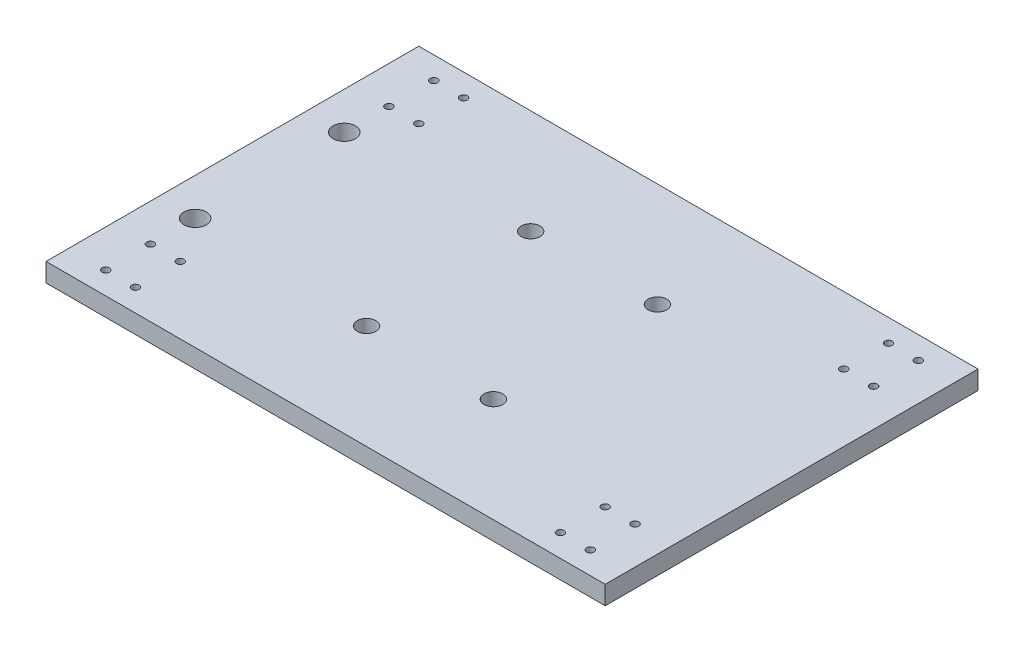
ISO-10303-21;
HEADER;
FILE_DESCRIPTION(('STEP AP214'),'2;1');
FILE_NAME('part.step','',(''),(''),'','','');
FILE_SCHEMA(('AUTOMOTIVE_DESIGN { 1 0 10303 214 1 1 1 1 }'));
ENDSEC;
DATA;
#1=APPLICATION_CONTEXT('core data for automotive mechanical design processes');
#2=APPLICATION_PROTOCOL_DEFINITION('international standard','automotive_design',2000,#1);
#3=PRODUCT_CONTEXT('',#1,'mechanical');
#4=PRODUCT('Part','Part','',(#3));
#5=PRODUCT_RELATED_PRODUCT_CATEGORY('part','',(#4));
#6=PRODUCT_DEFINITION_FORMATION('','',#4);
#7=PRODUCT_DEFINITION_CONTEXT('part definition',#1,'design');
#8=PRODUCT_DEFINITION('design','',#6,#7);
#9=PRODUCT_DEFINITION_SHAPE('','',#8);
#10=(LENGTH_UNIT() NAMED_UNIT(*) SI_UNIT(.MILLI.,.METRE.));
#11=(NAMED_UNIT(*) PLANE_ANGLE_UNIT() SI_UNIT($,.RADIAN.));
#12=(NAMED_UNIT(*) SI_UNIT($,.STERADIAN.) SOLID_ANGLE_UNIT());
#13=UNCERTAINTY_MEASURE_WITH_UNIT(LENGTH_MEASURE(1.E-05),#10,'distance_accuracy_value','');
#14=(GEOMETRIC_REPRESENTATION_CONTEXT(3) GLOBAL_UNCERTAINTY_ASSIGNED_CONTEXT((#13)) GLOBAL_UNIT_ASSIGNED_CONTEXT((#10,
#11,#12)) REPRESENTATION_CONTEXT('',''));
#15=CARTESIAN_POINT('',(0.,0.,0.));
#16=DIRECTION('',(0.,0.,1.));
#17=DIRECTION('',(1.,0.,0.));
#18=AXIS2_PLACEMENT_3D('',#15,#16,#17);
#19=CARTESIAN_POINT('',(75.,5.,-50.));
#20=DIRECTION('',(-1.,0.,0.));
#21=DIRECTION('',(0.,0.,1.));
#22=AXIS2_PLACEMENT_3D('',#19,#20,#21);
#23=PLANE('',#22);
#24=DIRECTION('',(0.,0.,-1.));
#25=VECTOR('',#24,1.);
#26=CARTESIAN_POINT('',(75.,0.,-50.));
#27=LINE('',#26,#25);
#28=CARTESIAN_POINT('',(75.,0.,50.));
#29=VERTEX_POINT('',#28);
#30=CARTESIAN_POINT('',(75.,0.,-50.));
#31=VERTEX_POINT('',#30);
#32=EDGE_CURVE('E100',#29,#31,#27,.T.);
#33=ORIENTED_EDGE('',*,*,#32,.T.);
#34=DIRECTION('',(0.,-1.,0.));
#35=VECTOR('',#34,1.);
#36=CARTESIAN_POINT('',(75.,5.,-50.));
#37=LINE('',#36,#35);
#38=CARTESIAN_POINT('',(75.,5.,-50.));
#39=VERTEX_POINT('',#38);
#40=EDGE_CURVE('E11',#39,#31,#37,.T.);
#41=ORIENTED_EDGE('',*,*,#40,.F.);
#42=DIRECTION('',(0.,0.,-1.));
#43=VECTOR('',#42,1.);
#44=CARTESIAN_POINT('',(75.,5.,-50.));
#45=LINE('',#44,#43);
#46=CARTESIAN_POINT('',(75.,5.,50.));
#47=VERTEX_POINT('',#46);
#48=EDGE_CURVE('E88',#47,#39,#45,.T.);
#49=ORIENTED_EDGE('',*,*,#48,.F.);
#50=DIRECTION('',(0.,-1.,0.));
#51=VECTOR('',#50,1.);
#52=CARTESIAN_POINT('',(75.,5.,50.));
#53=LINE('',#52,#51);
#54=EDGE_CURVE('E96',#47,#29,#53,.T.);
#55=ORIENTED_EDGE('',*,*,#54,.T.);
#56=EDGE_LOOP('',(#33,#41,#49,#55));
#57=FACE_BOUND('',#56,.T.);
#58=ADVANCED_FACE('F37',(#57),#23,.F.);
#59=CARTESIAN_POINT('',(-75.,5.,-50.));
#60=DIRECTION('',(0.,0.,1.));
#61=DIRECTION('',(1.,0.,0.));
#62=AXIS2_PLACEMENT_3D('',#59,#60,#61);
#63=PLANE('',#62);
#64=DIRECTION('',(-1.,0.,0.));
#65=VECTOR('',#64,1.);
#66=CARTESIAN_POINT('',(-75.,0.,-50.));
#67=LINE('',#66,#65);
#68=CARTESIAN_POINT('',(-75.,0.,-50.));
#69=VERTEX_POINT('',#68);
#70=EDGE_CURVE('E92',#31,#69,#67,.T.);
#71=ORIENTED_EDGE('',*,*,#70,.T.);
#72=DIRECTION('',(0.,-1.,0.));
#73=VECTOR('',#72,1.);
#74=CARTESIAN_POINT('',(-75.,5.,-50.));
#75=LINE('',#74,#73);
#76=CARTESIAN_POINT('',(-75.,5.,-50.));
#77=VERTEX_POINT('',#76);
#78=EDGE_CURVE('E45',#77,#69,#75,.T.);
#79=ORIENTED_EDGE('',*,*,#78,.F.);
#80=DIRECTION('',(-1.,0.,0.));
#81=VECTOR('',#80,1.);
#82=CARTESIAN_POINT('',(-75.,5.,-50.));
#83=LINE('',#82,#81);
#84=EDGE_CURVE('E83',#39,#77,#83,.T.);
#85=ORIENTED_EDGE('',*,*,#84,.F.);
#86=ORIENTED_EDGE('',*,*,#40,.T.);
#87=EDGE_LOOP('',(#71,#79,#85,#86));
#88=FACE_BOUND('',#87,.T.);
#89=ADVANCED_FACE('F91',(#88),#63,.F.);
#90=CARTESIAN_POINT('',(-75.,5.,-50.));
#91=DIRECTION('',(1.,0.,0.));
#92=DIRECTION('',(0.,0.,-1.));
#93=AXIS2_PLACEMENT_3D('',#90,#91,#92);
#94=PLANE('',#93);
#95=DIRECTION('',(0.,0.,1.));
#96=VECTOR('',#95,1.);
#97=CARTESIAN_POINT('',(-75.,0.,-50.));
#98=LINE('',#97,#96);
#99=CARTESIAN_POINT('',(-75.,0.,50.));
#100=VERTEX_POINT('',#99);
#101=EDGE_CURVE('E70',#69,#100,#98,.T.);
#102=ORIENTED_EDGE('',*,*,#101,.T.);
#103=DIRECTION('',(0.,-1.,0.));
#104=VECTOR('',#103,1.);
#105=CARTESIAN_POINT('',(-75.,5.,50.));
#106=LINE('',#105,#104);
#107=CARTESIAN_POINT('',(-75.,5.,50.));
#108=VERTEX_POINT('',#107);
#109=EDGE_CURVE('E93',#108,#100,#106,.T.);
#110=ORIENTED_EDGE('',*,*,#109,.F.);
#111=DIRECTION('',(0.,0.,1.));
#112=VECTOR('',#111,1.);
#113=CARTESIAN_POINT('',(-75.,5.,-50.));
#114=LINE('',#113,#112);
#115=EDGE_CURVE('E86',#77,#108,#114,.T.);
#116=ORIENTED_EDGE('',*,*,#115,.F.);
#117=ORIENTED_EDGE('',*,*,#78,.T.);
#118=EDGE_LOOP('',(#102,#110,#116,#117));
#119=FACE_BOUND('',#118,.T.);
#120=ADVANCED_FACE('F94',(#119),#94,.F.);
#121=CARTESIAN_POINT('',(-75.,5.,50.));
#122=DIRECTION('',(0.,0.,-1.));
#123=DIRECTION('',(-1.,0.,0.));
#124=AXIS2_PLACEMENT_3D('',#121,#122,#123);
#125=PLANE('',#124);
#126=DIRECTION('',(1.,0.,0.));
#127=VECTOR('',#126,1.);
#128=CARTESIAN_POINT('',(-75.,0.,50.));
#129=LINE('',#128,#127);
#130=EDGE_CURVE('E76',#100,#29,#129,.T.);
#131=ORIENTED_EDGE('',*,*,#130,.T.);
#132=ORIENTED_EDGE('',*,*,#54,.F.);
#133=DIRECTION('',(1.,0.,0.));
#134=VECTOR('',#133,1.);
#135=CARTESIAN_POINT('',(-75.,5.,50.));
#136=LINE('',#135,#134);
#137=EDGE_CURVE('E53',#108,#47,#136,.T.);
#138=ORIENTED_EDGE('',*,*,#137,.F.);
#139=ORIENTED_EDGE('',*,*,#109,.T.);
#140=EDGE_LOOP('',(#131,#132,#138,#139));
#141=FACE_BOUND('',#140,.T.);
#142=ADVANCED_FACE('F108',(#141),#125,.F.);
#143=CARTESIAN_POINT('',(0.,5.,0.));
#144=DIRECTION('',(0.,1.,0.));
#145=DIRECTION('',(0.,0.,1.));
#146=AXIS2_PLACEMENT_3D('',#143,#144,#145);
#147=PLANE('',#146);
#148=CARTESIAN_POINT('',(-65.,5.,-20.));
#149=DIRECTION('',(0.,1.,0.));
#150=DIRECTION('',(0.,0.,1.));
#151=AXIS2_PLACEMENT_3D('',#148,#149,#150);
#152=CIRCLE('',#151,3.);
#153=CARTESIAN_POINT('',(-65.,5.,-17.));
#154=VERTEX_POINT('',#153);
#155=EDGE_CURVE('E240',#154,#154,#152,.T.);
#156=ORIENTED_EDGE('',*,*,#155,.F.);
#157=EDGE_LOOP('',(#156));
#158=FACE_BOUND('',#157,.T.);
#159=CARTESIAN_POINT('',(-65.,5.,20.));
#160=DIRECTION('',(0.,1.,0.));
#161=DIRECTION('',(0.,0.,-1.));
#162=AXIS2_PLACEMENT_3D('',#159,#160,#161);
#163=CIRCLE('',#162,2.99999999999999);
#164=CARTESIAN_POINT('',(-65.,5.,17.));
#165=VERTEX_POINT('',#164);
#166=EDGE_CURVE('E234',#165,#165,#163,.T.);
#167=ORIENTED_EDGE('',*,*,#166,.F.);
#168=EDGE_LOOP('',(#167));
#169=FACE_BOUND('',#168,.T.);
#170=CARTESIAN_POINT('',(57.,5.,-44.));
#171=DIRECTION('',(0.,1.,0.));
#172=DIRECTION('',(0.,0.,1.));
#173=AXIS2_PLACEMENT_3D('',#170,#171,#172);
#174=CIRCLE('',#173,0.999999999999992);
#175=CARTESIAN_POINT('',(57.,5.,-43.));
#176=VERTEX_POINT('',#175);
#177=EDGE_CURVE('E180',#176,#176,#174,.T.);
#178=ORIENTED_EDGE('',*,*,#177,.F.);
#179=EDGE_LOOP('',(#178));
#180=FACE_BOUND('',#179,.T.);
#181=CARTESIAN_POINT('',(-57.,5.,-32.));
#182=DIRECTION('',(0.,1.,0.));
#183=DIRECTION('',(0.,0.,-1.));
#184=AXIS2_PLACEMENT_3D('',#181,#182,#183);
#185=CIRCLE('',#184,0.999999999999998);
#186=CARTESIAN_POINT('',(-57.,5.,-33.));
#187=VERTEX_POINT('',#186);
#188=EDGE_CURVE('E187',#187,#187,#185,.T.);
#189=ORIENTED_EDGE('',*,*,#188,.F.);
#190=EDGE_LOOP('',(#189));
#191=FACE_BOUND('',#190,.T.);
#192=CARTESIAN_POINT('',(-65.,5.,-32.));
#193=DIRECTION('',(0.,1.,0.));
#194=DIRECTION('',(0.,0.,-1.));
#195=AXIS2_PLACEMENT_3D('',#192,#193,#194);
#196=CIRCLE('',#195,0.999999999999998);
#197=CARTESIAN_POINT('',(-65.,5.,-33.));
#198=VERTEX_POINT('',#197);
#199=EDGE_CURVE('E168',#198,#198,#196,.T.);
#200=ORIENTED_EDGE('',*,*,#199,.F.);
#201=EDGE_LOOP('',(#200));
#202=FACE_BOUND('',#201,.T.);
#203=CARTESIAN_POINT('',(57.,5.,44.));
#204=DIRECTION('',(0.,1.,0.));
#205=DIRECTION('',(0.,0.,-1.));
#206=AXIS2_PLACEMENT_3D('',#203,#204,#205);
#207=CIRCLE('',#206,0.999999999999992);
#208=CARTESIAN_POINT('',(57.,5.,43.));
#209=VERTEX_POINT('',#208);
#210=EDGE_CURVE('E175',#209,#209,#207,.T.);
#211=ORIENTED_EDGE('',*,*,#210,.F.);
#212=EDGE_LOOP('',(#211));
#213=FACE_BOUND('',#212,.T.);
#214=CARTESIAN_POINT('',(-57.,5.,44.));
#215=DIRECTION('',(0.,1.,0.));
#216=DIRECTION('',(0.,0.,1.));
#217=AXIS2_PLACEMENT_3D('',#214,#215,#216);
#218=CIRCLE('',#217,0.999999999999998);
#219=CARTESIAN_POINT('',(-57.,5.,45.));
#220=VERTEX_POINT('',#219);
#221=EDGE_CURVE('E204',#220,#220,#218,.T.);
#222=ORIENTED_EDGE('',*,*,#221,.F.);
#223=EDGE_LOOP('',(#222));
#224=FACE_BOUND('',#223,.T.);
#225=CARTESIAN_POINT('',(-57.,5.,-44.));
#226=DIRECTION('',(0.,1.,0.));
#227=DIRECTION('',(0.,0.,-1.));
#228=AXIS2_PLACEMENT_3D('',#225,#226,#227);
#229=CIRCLE('',#228,0.999999999999998);
#230=CARTESIAN_POINT('',(-57.,5.,-45.));
#231=VERTEX_POINT('',#230);
#232=EDGE_CURVE('E211',#231,#231,#229,.T.);
#233=ORIENTED_EDGE('',*,*,#232,.F.);
#234=EDGE_LOOP('',(#233));
#235=FACE_BOUND('',#234,.T.);
#236=CARTESIAN_POINT('',(-65.,5.,-44.));
#237=DIRECTION('',(0.,1.,0.));
#238=DIRECTION('',(0.,0.,-1.));
#239=AXIS2_PLACEMENT_3D('',#236,#237,#238);
#240=CIRCLE('',#239,0.999999999999998);
#241=CARTESIAN_POINT('',(-65.,5.,-45.));
#242=VERTEX_POINT('',#241);
#243=EDGE_CURVE('E192',#242,#242,#240,.T.);
#244=ORIENTED_EDGE('',*,*,#243,.F.);
#245=EDGE_LOOP('',(#244));
#246=FACE_BOUND('',#245,.T.);
#247=CARTESIAN_POINT('',(57.,5.,-32.));
#248=DIRECTION('',(0.,1.,0.));
#249=DIRECTION('',(0.,0.,1.));
#250=AXIS2_PLACEMENT_3D('',#247,#248,#249);
#251=CIRCLE('',#250,0.999999999999992);
#252=CARTESIAN_POINT('',(57.,5.,-31.));
#253=VERTEX_POINT('',#252);
#254=EDGE_CURVE('E199',#253,#253,#251,.T.);
#255=ORIENTED_EDGE('',*,*,#254,.F.);
#256=EDGE_LOOP('',(#255));
#257=FACE_BOUND('',#256,.T.);
#258=CARTESIAN_POINT('',(65.,5.,-44.));
#259=DIRECTION('',(0.,1.,0.));
#260=DIRECTION('',(0.,0.,1.));
#261=AXIS2_PLACEMENT_3D('',#258,#259,#260);
#262=CIRCLE('',#261,0.999999999999998);
#263=CARTESIAN_POINT('',(65.,5.,-43.));
#264=VERTEX_POINT('',#263);
#265=EDGE_CURVE('E132',#264,#264,#262,.T.);
#266=ORIENTED_EDGE('',*,*,#265,.F.);
#267=EDGE_LOOP('',(#266));
#268=FACE_BOUND('',#267,.T.);
#269=CARTESIAN_POINT('',(-17.,5.,22.));
#270=DIRECTION('',(0.,1.,0.));
#271=DIRECTION('',(0.,0.,1.));
#272=AXIS2_PLACEMENT_3D('',#269,#270,#271);
#273=CIRCLE('',#272,2.5);
#274=CARTESIAN_POINT('',(-17.,5.,24.5));
#275=VERTEX_POINT('',#274);
#276=EDGE_CURVE('E139',#275,#275,#273,.T.);
#277=ORIENTED_EDGE('',*,*,#276,.F.);
#278=EDGE_LOOP('',(#277));
#279=FACE_BOUND('',#278,.T.);
#280=CARTESIAN_POINT('',(-17.,5.,-22.));
#281=DIRECTION('',(0.,1.,0.));
#282=DIRECTION('',(0.,0.,-1.));
#283=AXIS2_PLACEMENT_3D('',#280,#281,#282);
#284=CIRCLE('',#283,2.5);
#285=CARTESIAN_POINT('',(-17.,5.,-24.5));
#286=VERTEX_POINT('',#285);
#287=EDGE_CURVE('E120',#286,#286,#284,.T.);
#288=ORIENTED_EDGE('',*,*,#287,.F.);
#289=EDGE_LOOP('',(#288));
#290=FACE_BOUND('',#289,.T.);
#291=CARTESIAN_POINT('',(17.,5.,22.));
#292=DIRECTION('',(0.,1.,0.));
#293=DIRECTION('',(0.,0.,-1.));
#294=AXIS2_PLACEMENT_3D('',#291,#292,#293);
#295=CIRCLE('',#294,2.5);
#296=CARTESIAN_POINT('',(17.,5.,19.5));
#297=VERTEX_POINT('',#296);
#298=EDGE_CURVE('E127',#297,#297,#295,.T.);
#299=ORIENTED_EDGE('',*,*,#298,.F.);
#300=EDGE_LOOP('',(#299));
#301=FACE_BOUND('',#300,.T.);
#302=CARTESIAN_POINT('',(65.,5.,44.));
#303=DIRECTION('',(0.,1.,0.));
#304=DIRECTION('',(0.,0.,-1.));
#305=AXIS2_PLACEMENT_3D('',#302,#303,#304);
#306=CIRCLE('',#305,0.999999999999998);
#307=CARTESIAN_POINT('',(65.,5.,43.));
#308=VERTEX_POINT('',#307);
#309=EDGE_CURVE('E156',#308,#308,#306,.T.);
#310=ORIENTED_EDGE('',*,*,#309,.F.);
#311=EDGE_LOOP('',(#310));
#312=FACE_BOUND('',#311,.T.);
#313=CARTESIAN_POINT('',(57.,5.,32.));
#314=DIRECTION('',(0.,1.,0.));
#315=DIRECTION('',(0.,0.,-1.));
#316=AXIS2_PLACEMENT_3D('',#313,#314,#315);
#317=CIRCLE('',#316,0.999999999999992);
#318=CARTESIAN_POINT('',(57.,5.,31.));
#319=VERTEX_POINT('',#318);
#320=EDGE_CURVE('E163',#319,#319,#317,.T.);
#321=ORIENTED_EDGE('',*,*,#320,.F.);
#322=EDGE_LOOP('',(#321));
#323=FACE_BOUND('',#322,.T.);
#324=CARTESIAN_POINT('',(65.,5.,32.));
#325=DIRECTION('',(0.,1.,0.));
#326=DIRECTION('',(0.,0.,-1.));
#327=AXIS2_PLACEMENT_3D('',#324,#325,#326);
#328=CIRCLE('',#327,0.999999999999998);
#329=CARTESIAN_POINT('',(65.,5.,31.));
#330=VERTEX_POINT('',#329);
#331=EDGE_CURVE('E144',#330,#330,#328,.T.);
#332=ORIENTED_EDGE('',*,*,#331,.F.);
#333=EDGE_LOOP('',(#332));
#334=FACE_BOUND('',#333,.T.);
#335=CARTESIAN_POINT('',(65.,5.,-32.));
#336=DIRECTION('',(0.,1.,0.));
#337=DIRECTION('',(0.,0.,1.));
#338=AXIS2_PLACEMENT_3D('',#335,#336,#337);
#339=CIRCLE('',#338,0.999999999999998);
#340=CARTESIAN_POINT('',(65.,5.,-31.));
#341=VERTEX_POINT('',#340);
#342=EDGE_CURVE('E151',#341,#341,#339,.T.);
#343=ORIENTED_EDGE('',*,*,#342,.F.);
#344=EDGE_LOOP('',(#343));
#345=FACE_BOUND('',#344,.T.);
#346=CARTESIAN_POINT('',(-65.,5.,32.));
#347=DIRECTION('',(0.,1.,0.));
#348=DIRECTION('',(0.,0.,1.));
#349=AXIS2_PLACEMENT_3D('',#346,#347,#348);
#350=CIRCLE('',#349,0.999999999999998);
#351=CARTESIAN_POINT('',(-65.,5.,33.));
#352=VERTEX_POINT('',#351);
#353=EDGE_CURVE('E228',#352,#352,#350,.T.);
#354=ORIENTED_EDGE('',*,*,#353,.F.);
#355=EDGE_LOOP('',(#354));
#356=FACE_BOUND('',#355,.T.);
#357=CARTESIAN_POINT('',(-57.,5.,32.));
#358=DIRECTION('',(0.,1.,0.));
#359=DIRECTION('',(0.,0.,1.));
#360=AXIS2_PLACEMENT_3D('',#357,#358,#359);
#361=CIRCLE('',#360,0.999999999999998);
#362=CARTESIAN_POINT('',(-57.,5.,33.));
#363=VERTEX_POINT('',#362);
#364=EDGE_CURVE('E216',#363,#363,#361,.T.);
#365=ORIENTED_EDGE('',*,*,#364,.F.);
#366=EDGE_LOOP('',(#365));
#367=FACE_BOUND('',#366,.T.);
#368=CARTESIAN_POINT('',(-65.,5.,44.));
#369=DIRECTION('',(0.,1.,0.));
#370=DIRECTION('',(0.,0.,1.));
#371=AXIS2_PLACEMENT_3D('',#368,#369,#370);
#372=CIRCLE('',#371,0.999999999999998);
#373=CARTESIAN_POINT('',(-65.,5.,45.));
#374=VERTEX_POINT('',#373);
#375=EDGE_CURVE('E223',#374,#374,#372,.T.);
#376=ORIENTED_EDGE('',*,*,#375,.F.);
#377=EDGE_LOOP('',(#376));
#378=FACE_BOUND('',#377,.T.);
#379=CARTESIAN_POINT('',(17.,5.,-22.));
#380=DIRECTION('',(0.,1.,0.));
#381=DIRECTION('',(0.,0.,1.));
#382=AXIS2_PLACEMENT_3D('',#379,#380,#381);
#383=CIRCLE('',#382,2.5);
#384=CARTESIAN_POINT('',(17.,5.,-19.5));
#385=VERTEX_POINT('',#384);
#386=EDGE_CURVE('E114',#385,#385,#383,.T.);
#387=ORIENTED_EDGE('',*,*,#386,.F.);
#388=EDGE_LOOP('',(#387));
#389=FACE_BOUND('',#388,.T.);
#390=ORIENTED_EDGE('',*,*,#48,.T.);
#391=ORIENTED_EDGE('',*,*,#84,.T.);
#392=ORIENTED_EDGE('',*,*,#115,.T.);
#393=ORIENTED_EDGE('',*,*,#137,.T.);
#394=EDGE_LOOP('',(#390,#391,#392,#393));
#395=FACE_BOUND('',#394,.T.);
#396=ADVANCED_FACE('F84',(#158,#169,#180,#191,#202,#213,#224,#235,#246,#257,#268,#279,#290,#301,
#312,#323,#334,#345,#356,#367,#378,#389,#395),#147,.T.);
#397=CARTESIAN_POINT('',(0.,0.,0.));
#398=DIRECTION('',(0.,1.,0.));
#399=DIRECTION('',(0.,0.,1.));
#400=AXIS2_PLACEMENT_3D('',#397,#398,#399);
#401=PLANE('',#400);
#402=CARTESIAN_POINT('',(-65.,0.,-20.));
#403=DIRECTION('',(0.,1.,0.));
#404=DIRECTION('',(0.,0.,1.));
#405=AXIS2_PLACEMENT_3D('',#402,#403,#404);
#406=CIRCLE('',#405,3.);
#407=CARTESIAN_POINT('',(-65.,0.,-17.));
#408=VERTEX_POINT('',#407);
#409=EDGE_CURVE('E231',#408,#408,#406,.T.);
#410=ORIENTED_EDGE('',*,*,#409,.T.);
#411=EDGE_LOOP('',(#410));
#412=FACE_BOUND('',#411,.T.);
#413=CARTESIAN_POINT('',(-65.,0.,20.));
#414=DIRECTION('',(0.,1.,0.));
#415=DIRECTION('',(0.,0.,-1.));
#416=AXIS2_PLACEMENT_3D('',#413,#414,#415);
#417=CIRCLE('',#416,2.99999999999999);
#418=CARTESIAN_POINT('',(-65.,0.,17.));
#419=VERTEX_POINT('',#418);
#420=EDGE_CURVE('E237',#419,#419,#417,.T.);
#421=ORIENTED_EDGE('',*,*,#420,.T.);
#422=EDGE_LOOP('',(#421));
#423=FACE_BOUND('',#422,.T.);
#424=CARTESIAN_POINT('',(57.,0.,-44.));
#425=DIRECTION('',(0.,1.,0.));
#426=DIRECTION('',(0.,0.,1.));
#427=AXIS2_PLACEMENT_3D('',#424,#425,#426);
#428=CIRCLE('',#427,0.999999999999992);
#429=CARTESIAN_POINT('',(57.,0.,-43.));
#430=VERTEX_POINT('',#429);
#431=EDGE_CURVE('E183',#430,#430,#428,.T.);
#432=ORIENTED_EDGE('',*,*,#431,.T.);
#433=EDGE_LOOP('',(#432));
#434=FACE_BOUND('',#433,.T.);
#435=CARTESIAN_POINT('',(-57.,0.,-32.));
#436=DIRECTION('',(0.,1.,0.));
#437=DIRECTION('',(0.,0.,-1.));
#438=AXIS2_PLACEMENT_3D('',#435,#436,#437);
#439=CIRCLE('',#438,0.999999999999998);
#440=CARTESIAN_POINT('',(-57.,0.,-33.));
#441=VERTEX_POINT('',#440);
#442=EDGE_CURVE('E172',#441,#441,#439,.T.);
#443=ORIENTED_EDGE('',*,*,#442,.T.);
#444=EDGE_LOOP('',(#443));
#445=FACE_BOUND('',#444,.T.);
#446=CARTESIAN_POINT('',(-65.,0.,-32.));
#447=DIRECTION('',(0.,1.,0.));
#448=DIRECTION('',(0.,0.,-1.));
#449=AXIS2_PLACEMENT_3D('',#446,#447,#448);
#450=CIRCLE('',#449,0.999999999999998);
#451=CARTESIAN_POINT('',(-65.,0.,-33.));
#452=VERTEX_POINT('',#451);
#453=EDGE_CURVE('E171',#452,#452,#450,.T.);
#454=ORIENTED_EDGE('',*,*,#453,.T.);
#455=EDGE_LOOP('',(#454));
#456=FACE_BOUND('',#455,.T.);
#457=CARTESIAN_POINT('',(57.,0.,44.));
#458=DIRECTION('',(0.,1.,0.));
#459=DIRECTION('',(0.,0.,-1.));
#460=AXIS2_PLACEMENT_3D('',#457,#458,#459);
#461=CIRCLE('',#460,0.999999999999992);
#462=CARTESIAN_POINT('',(57.,0.,43.));
#463=VERTEX_POINT('',#462);
#464=EDGE_CURVE('E160',#463,#463,#461,.T.);
#465=ORIENTED_EDGE('',*,*,#464,.T.);
#466=EDGE_LOOP('',(#465));
#467=FACE_BOUND('',#466,.T.);
#468=CARTESIAN_POINT('',(-57.,0.,44.));
#469=DIRECTION('',(0.,1.,0.));
#470=DIRECTION('',(0.,0.,1.));
#471=AXIS2_PLACEMENT_3D('',#468,#469,#470);
#472=CIRCLE('',#471,0.999999999999998);
#473=CARTESIAN_POINT('',(-57.,0.,45.));
#474=VERTEX_POINT('',#473);
#475=EDGE_CURVE('E207',#474,#474,#472,.T.);
#476=ORIENTED_EDGE('',*,*,#475,.T.);
#477=EDGE_LOOP('',(#476));
#478=FACE_BOUND('',#477,.T.);
#479=CARTESIAN_POINT('',(-57.,0.,-44.));
#480=DIRECTION('',(0.,1.,0.));
#481=DIRECTION('',(0.,0.,-1.));
#482=AXIS2_PLACEMENT_3D('',#479,#480,#481);
#483=CIRCLE('',#482,0.999999999999998);
#484=CARTESIAN_POINT('',(-57.,0.,-45.));
#485=VERTEX_POINT('',#484);
#486=EDGE_CURVE('E196',#485,#485,#483,.T.);
#487=ORIENTED_EDGE('',*,*,#486,.T.);
#488=EDGE_LOOP('',(#487));
#489=FACE_BOUND('',#488,.T.);
#490=CARTESIAN_POINT('',(-65.,0.,-44.));
#491=DIRECTION('',(0.,1.,0.));
#492=DIRECTION('',(0.,0.,-1.));
#493=AXIS2_PLACEMENT_3D('',#490,#491,#492);
#494=CIRCLE('',#493,0.999999999999998);
#495=CARTESIAN_POINT('',(-65.,0.,-45.));
#496=VERTEX_POINT('',#495);
#497=EDGE_CURVE('E195',#496,#496,#494,.T.);
#498=ORIENTED_EDGE('',*,*,#497,.T.);
#499=EDGE_LOOP('',(#498));
#500=FACE_BOUND('',#499,.T.);
#501=CARTESIAN_POINT('',(57.,0.,-32.));
#502=DIRECTION('',(0.,1.,0.));
#503=DIRECTION('',(0.,0.,1.));
#504=AXIS2_PLACEMENT_3D('',#501,#502,#503);
#505=CIRCLE('',#504,0.999999999999992);
#506=CARTESIAN_POINT('',(57.,0.,-31.));
#507=VERTEX_POINT('',#506);
#508=EDGE_CURVE('E184',#507,#507,#505,.T.);
#509=ORIENTED_EDGE('',*,*,#508,.T.);
#510=EDGE_LOOP('',(#509));
#511=FACE_BOUND('',#510,.T.);
#512=CARTESIAN_POINT('',(65.,0.,-44.));
#513=DIRECTION('',(0.,1.,0.));
#514=DIRECTION('',(0.,0.,1.));
#515=AXIS2_PLACEMENT_3D('',#512,#513,#514);
#516=CIRCLE('',#515,0.999999999999998);
#517=CARTESIAN_POINT('',(65.,0.,-43.));
#518=VERTEX_POINT('',#517);
#519=EDGE_CURVE('E135',#518,#518,#516,.T.);
#520=ORIENTED_EDGE('',*,*,#519,.T.);
#521=EDGE_LOOP('',(#520));
#522=FACE_BOUND('',#521,.T.);
#523=CARTESIAN_POINT('',(-17.,0.,22.));
#524=DIRECTION('',(0.,1.,0.));
#525=DIRECTION('',(0.,0.,1.));
#526=AXIS2_PLACEMENT_3D('',#523,#524,#525);
#527=CIRCLE('',#526,2.5);
#528=CARTESIAN_POINT('',(-17.,0.,24.5));
#529=VERTEX_POINT('',#528);
#530=EDGE_CURVE('E124',#529,#529,#527,.T.);
#531=ORIENTED_EDGE('',*,*,#530,.T.);
#532=EDGE_LOOP('',(#531));
#533=FACE_BOUND('',#532,.T.);
#534=CARTESIAN_POINT('',(-17.,0.,-22.));
#535=DIRECTION('',(0.,1.,0.));
#536=DIRECTION('',(0.,0.,-1.));
#537=AXIS2_PLACEMENT_3D('',#534,#535,#536);
#538=CIRCLE('',#537,2.5);
#539=CARTESIAN_POINT('',(-17.,0.,-24.5));
#540=VERTEX_POINT('',#539);
#541=EDGE_CURVE('E123',#540,#540,#538,.T.);
#542=ORIENTED_EDGE('',*,*,#541,.T.);
#543=EDGE_LOOP('',(#542));
#544=FACE_BOUND('',#543,.T.);
#545=CARTESIAN_POINT('',(17.,0.,22.));
#546=DIRECTION('',(0.,1.,0.));
#547=DIRECTION('',(0.,0.,-1.));
#548=AXIS2_PLACEMENT_3D('',#545,#546,#547);
#549=CIRCLE('',#548,2.5);
#550=CARTESIAN_POINT('',(17.,0.,19.5));
#551=VERTEX_POINT('',#550);
#552=EDGE_CURVE('E117',#551,#551,#549,.T.);
#553=ORIENTED_EDGE('',*,*,#552,.T.);
#554=EDGE_LOOP('',(#553));
#555=FACE_BOUND('',#554,.T.);
#556=CARTESIAN_POINT('',(65.,0.,44.));
#557=DIRECTION('',(0.,1.,0.));
#558=DIRECTION('',(0.,0.,-1.));
#559=AXIS2_PLACEMENT_3D('',#556,#557,#558);
#560=CIRCLE('',#559,0.999999999999998);
#561=CARTESIAN_POINT('',(65.,0.,43.));
#562=VERTEX_POINT('',#561);
#563=EDGE_CURVE('E159',#562,#562,#560,.T.);
#564=ORIENTED_EDGE('',*,*,#563,.T.);
#565=EDGE_LOOP('',(#564));
#566=FACE_BOUND('',#565,.T.);
#567=CARTESIAN_POINT('',(57.,0.,32.));
#568=DIRECTION('',(0.,1.,0.));
#569=DIRECTION('',(0.,0.,-1.));
#570=AXIS2_PLACEMENT_3D('',#567,#568,#569);
#571=CIRCLE('',#570,0.999999999999992);
#572=CARTESIAN_POINT('',(57.,0.,31.));
#573=VERTEX_POINT('',#572);
#574=EDGE_CURVE('E148',#573,#573,#571,.T.);
#575=ORIENTED_EDGE('',*,*,#574,.T.);
#576=EDGE_LOOP('',(#575));
#577=FACE_BOUND('',#576,.T.);
#578=CARTESIAN_POINT('',(65.,0.,32.));
#579=DIRECTION('',(0.,1.,0.));
#580=DIRECTION('',(0.,0.,-1.));
#581=AXIS2_PLACEMENT_3D('',#578,#579,#580);
#582=CIRCLE('',#581,0.999999999999998);
#583=CARTESIAN_POINT('',(65.,0.,31.));
#584=VERTEX_POINT('',#583);
#585=EDGE_CURVE('E147',#584,#584,#582,.T.);
#586=ORIENTED_EDGE('',*,*,#585,.T.);
#587=EDGE_LOOP('',(#586));
#588=FACE_BOUND('',#587,.T.);
#589=CARTESIAN_POINT('',(65.,0.,-32.));
#590=DIRECTION('',(0.,1.,0.));
#591=DIRECTION('',(0.,0.,1.));
#592=AXIS2_PLACEMENT_3D('',#589,#590,#591);
#593=CIRCLE('',#592,0.999999999999998);
#594=CARTESIAN_POINT('',(65.,0.,-31.));
#595=VERTEX_POINT('',#594);
#596=EDGE_CURVE('E136',#595,#595,#593,.T.);
#597=ORIENTED_EDGE('',*,*,#596,.T.);
#598=EDGE_LOOP('',(#597));
#599=FACE_BOUND('',#598,.T.);
#600=CARTESIAN_POINT('',(-65.,0.,32.));
#601=DIRECTION('',(0.,1.,0.));
#602=DIRECTION('',(0.,0.,1.));
#603=AXIS2_PLACEMENT_3D('',#600,#601,#602);
#604=CIRCLE('',#603,0.999999999999998);
#605=CARTESIAN_POINT('',(-65.,0.,33.));
#606=VERTEX_POINT('',#605);
#607=EDGE_CURVE('E220',#606,#606,#604,.T.);
#608=ORIENTED_EDGE('',*,*,#607,.T.);
#609=EDGE_LOOP('',(#608));
#610=FACE_BOUND('',#609,.T.);
#611=CARTESIAN_POINT('',(-57.,0.,32.));
#612=DIRECTION('',(0.,1.,0.));
#613=DIRECTION('',(0.,0.,1.));
#614=AXIS2_PLACEMENT_3D('',#611,#612,#613);
#615=CIRCLE('',#614,0.999999999999998);
#616=CARTESIAN_POINT('',(-57.,0.,33.));
#617=VERTEX_POINT('',#616);
#618=EDGE_CURVE('E219',#617,#617,#615,.T.);
#619=ORIENTED_EDGE('',*,*,#618,.T.);
#620=EDGE_LOOP('',(#619));
#621=FACE_BOUND('',#620,.T.);
#622=CARTESIAN_POINT('',(-65.,0.,44.));
#623=DIRECTION('',(0.,1.,0.));
#624=DIRECTION('',(0.,0.,1.));
#625=AXIS2_PLACEMENT_3D('',#622,#623,#624);
#626=CIRCLE('',#625,0.999999999999998);
#627=CARTESIAN_POINT('',(-65.,0.,45.));
#628=VERTEX_POINT('',#627);
#629=EDGE_CURVE('E208',#628,#628,#626,.T.);
#630=ORIENTED_EDGE('',*,*,#629,.T.);
#631=EDGE_LOOP('',(#630));
#632=FACE_BOUND('',#631,.T.);
#633=CARTESIAN_POINT('',(17.,0.,-22.));
#634=DIRECTION('',(0.,1.,0.));
#635=DIRECTION('',(0.,0.,1.));
#636=AXIS2_PLACEMENT_3D('',#633,#634,#635);
#637=CIRCLE('',#636,2.5);
#638=CARTESIAN_POINT('',(17.,0.,-19.5));
#639=VERTEX_POINT('',#638);
#640=EDGE_CURVE('E103',#639,#639,#637,.T.);
#641=ORIENTED_EDGE('',*,*,#640,.T.);
#642=EDGE_LOOP('',(#641));
#643=FACE_BOUND('',#642,.T.);
#644=ORIENTED_EDGE('',*,*,#32,.F.);
#645=ORIENTED_EDGE('',*,*,#130,.F.);
#646=ORIENTED_EDGE('',*,*,#101,.F.);
#647=ORIENTED_EDGE('',*,*,#70,.F.);
#648=EDGE_LOOP('',(#644,#645,#646,#647));
#649=FACE_BOUND('',#648,.T.);
#650=ADVANCED_FACE('F111',(#412,#423,#434,#445,#456,#467,#478,#489,#500,#511,#522,#533,#544,
#555,#566,#577,#588,#599,#610,#621,#632,#643,#649),#401,.F.);
#651=CARTESIAN_POINT('',(17.,0.,-22.));
#652=DIRECTION('',(0.,1.,0.));
#653=DIRECTION('',(0.,0.,1.));
#654=AXIS2_PLACEMENT_3D('',#651,#652,#653);
#655=CYLINDRICAL_SURFACE('',#654,2.5);
#656=ORIENTED_EDGE('',*,*,#640,.F.);
#657=EDGE_LOOP('',(#656));
#658=FACE_BOUND('',#657,.T.);
#659=ORIENTED_EDGE('',*,*,#386,.T.);
#660=EDGE_LOOP('',(#659));
#661=FACE_BOUND('',#660,.T.);
#662=ADVANCED_FACE('F300',(#658,#661),#655,.F.);
#663=CARTESIAN_POINT('',(-65.,0.,44.));
#664=DIRECTION('',(0.,1.,0.));
#665=DIRECTION('',(0.,0.,1.));
#666=AXIS2_PLACEMENT_3D('',#663,#664,#665);
#667=CYLINDRICAL_SURFACE('',#666,0.999999999999998);
#668=ORIENTED_EDGE('',*,*,#629,.F.);
#669=EDGE_LOOP('',(#668));
#670=FACE_BOUND('',#669,.T.);
#671=ORIENTED_EDGE('',*,*,#375,.T.);
#672=EDGE_LOOP('',(#671));
#673=FACE_BOUND('',#672,.T.);
#674=ADVANCED_FACE('F302',(#670,#673),#667,.F.);
#675=CARTESIAN_POINT('',(-57.,0.,32.));
#676=DIRECTION('',(0.,1.,0.));
#677=DIRECTION('',(0.,0.,1.));
#678=AXIS2_PLACEMENT_3D('',#675,#676,#677);
#679=CYLINDRICAL_SURFACE('',#678,0.999999999999998);
#680=ORIENTED_EDGE('',*,*,#618,.F.);
#681=EDGE_LOOP('',(#680));
#682=FACE_BOUND('',#681,.T.);
#683=ORIENTED_EDGE('',*,*,#364,.T.);
#684=EDGE_LOOP('',(#683));
#685=FACE_BOUND('',#684,.T.);
#686=ADVANCED_FACE('F309',(#682,#685),#679,.F.);
#687=CARTESIAN_POINT('',(-65.,0.,32.));
#688=DIRECTION('',(0.,1.,0.));
#689=DIRECTION('',(0.,0.,1.));
#690=AXIS2_PLACEMENT_3D('',#687,#688,#689);
#691=CYLINDRICAL_SURFACE('',#690,0.999999999999998);
#692=ORIENTED_EDGE('',*,*,#607,.F.);
#693=EDGE_LOOP('',(#692));
#694=FACE_BOUND('',#693,.T.);
#695=ORIENTED_EDGE('',*,*,#353,.T.);
#696=EDGE_LOOP('',(#695));
#697=FACE_BOUND('',#696,.T.);
#698=ADVANCED_FACE('F481',(#694,#697),#691,.F.);
#699=CARTESIAN_POINT('',(65.,0.,-32.));
#700=DIRECTION('',(0.,1.,0.));
#701=DIRECTION('',(0.,0.,1.));
#702=AXIS2_PLACEMENT_3D('',#699,#700,#701);
#703=CYLINDRICAL_SURFACE('',#702,0.999999999999998);
#704=ORIENTED_EDGE('',*,*,#596,.F.);
#705=EDGE_LOOP('',(#704));
#706=FACE_BOUND('',#705,.T.);
#707=ORIENTED_EDGE('',*,*,#342,.T.);
#708=EDGE_LOOP('',(#707));
#709=FACE_BOUND('',#708,.T.);
#710=ADVANCED_FACE('F473',(#706,#709),#703,.F.);
#711=CARTESIAN_POINT('',(65.,0.,32.));
#712=DIRECTION('',(0.,1.,0.));
#713=DIRECTION('',(0.,0.,1.));
#714=AXIS2_PLACEMENT_3D('',#711,#712,#713);
#715=CYLINDRICAL_SURFACE('',#714,0.999999999999998);
#716=ORIENTED_EDGE('',*,*,#585,.F.);
#717=EDGE_LOOP('',(#716));
#718=FACE_BOUND('',#717,.T.);
#719=ORIENTED_EDGE('',*,*,#331,.T.);
#720=EDGE_LOOP('',(#719));
#721=FACE_BOUND('',#720,.T.);
#722=ADVANCED_FACE('F465',(#718,#721),#715,.F.);
#723=CARTESIAN_POINT('',(57.,0.,32.));
#724=DIRECTION('',(0.,1.,0.));
#725=DIRECTION('',(0.,0.,1.));
#726=AXIS2_PLACEMENT_3D('',#723,#724,#725);
#727=CYLINDRICAL_SURFACE('',#726,0.999999999999992);
#728=ORIENTED_EDGE('',*,*,#574,.F.);
#729=EDGE_LOOP('',(#728));
#730=FACE_BOUND('',#729,.T.);
#731=ORIENTED_EDGE('',*,*,#320,.T.);
#732=EDGE_LOOP('',(#731));
#733=FACE_BOUND('',#732,.T.);
#734=ADVANCED_FACE('F457',(#730,#733),#727,.F.);
#735=CARTESIAN_POINT('',(65.,0.,44.));
#736=DIRECTION('',(0.,1.,0.));
#737=DIRECTION('',(0.,0.,1.));
#738=AXIS2_PLACEMENT_3D('',#735,#736,#737);
#739=CYLINDRICAL_SURFACE('',#738,0.999999999999998);
#740=ORIENTED_EDGE('',*,*,#563,.F.);
#741=EDGE_LOOP('',(#740));
#742=FACE_BOUND('',#741,.T.);
#743=ORIENTED_EDGE('',*,*,#309,.T.);
#744=EDGE_LOOP('',(#743));
#745=FACE_BOUND('',#744,.T.);
#746=ADVANCED_FACE('F449',(#742,#745),#739,.F.);
#747=CARTESIAN_POINT('',(17.,0.,22.));
#748=DIRECTION('',(0.,1.,0.));
#749=DIRECTION('',(0.,0.,1.));
#750=AXIS2_PLACEMENT_3D('',#747,#748,#749);
#751=CYLINDRICAL_SURFACE('',#750,2.5);
#752=ORIENTED_EDGE('',*,*,#552,.F.);
#753=EDGE_LOOP('',(#752));
#754=FACE_BOUND('',#753,.T.);
#755=ORIENTED_EDGE('',*,*,#298,.T.);
#756=EDGE_LOOP('',(#755));
#757=FACE_BOUND('',#756,.T.);
#758=ADVANCED_FACE('F442',(#754,#757),#751,.F.);
#759=CARTESIAN_POINT('',(-17.,0.,-22.));
#760=DIRECTION('',(0.,1.,0.));
#761=DIRECTION('',(0.,0.,1.));
#762=AXIS2_PLACEMENT_3D('',#759,#760,#761);
#763=CYLINDRICAL_SURFACE('',#762,2.5);
#764=ORIENTED_EDGE('',*,*,#541,.F.);
#765=EDGE_LOOP('',(#764));
#766=FACE_BOUND('',#765,.T.);
#767=ORIENTED_EDGE('',*,*,#287,.T.);
#768=EDGE_LOOP('',(#767));
#769=FACE_BOUND('',#768,.T.);
#770=ADVANCED_FACE('F434',(#766,#769),#763,.F.);
#771=CARTESIAN_POINT('',(-17.,0.,22.));
#772=DIRECTION('',(0.,1.,0.));
#773=DIRECTION('',(0.,0.,1.));
#774=AXIS2_PLACEMENT_3D('',#771,#772,#773);
#775=CYLINDRICAL_SURFACE('',#774,2.5);
#776=ORIENTED_EDGE('',*,*,#530,.F.);
#777=EDGE_LOOP('',(#776));
#778=FACE_BOUND('',#777,.T.);
#779=ORIENTED_EDGE('',*,*,#276,.T.);
#780=EDGE_LOOP('',(#779));
#781=FACE_BOUND('',#780,.T.);
#782=ADVANCED_FACE('F426',(#778,#781),#775,.F.);
#783=CARTESIAN_POINT('',(65.,0.,-44.));
#784=DIRECTION('',(0.,1.,0.));
#785=DIRECTION('',(0.,0.,1.));
#786=AXIS2_PLACEMENT_3D('',#783,#784,#785);
#787=CYLINDRICAL_SURFACE('',#786,0.999999999999998);
#788=ORIENTED_EDGE('',*,*,#519,.F.);
#789=EDGE_LOOP('',(#788));
#790=FACE_BOUND('',#789,.T.);
#791=ORIENTED_EDGE('',*,*,#265,.T.);
#792=EDGE_LOOP('',(#791));
#793=FACE_BOUND('',#792,.T.);
#794=ADVANCED_FACE('F418',(#790,#793),#787,.F.);
#795=CARTESIAN_POINT('',(57.,0.,-32.));
#796=DIRECTION('',(0.,1.,0.));
#797=DIRECTION('',(0.,0.,1.));
#798=AXIS2_PLACEMENT_3D('',#795,#796,#797);
#799=CYLINDRICAL_SURFACE('',#798,0.999999999999992);
#800=ORIENTED_EDGE('',*,*,#508,.F.);
#801=EDGE_LOOP('',(#800));
#802=FACE_BOUND('',#801,.T.);
#803=ORIENTED_EDGE('',*,*,#254,.T.);
#804=EDGE_LOOP('',(#803));
#805=FACE_BOUND('',#804,.T.);
#806=ADVANCED_FACE('F410',(#802,#805),#799,.F.);
#807=CARTESIAN_POINT('',(-65.,0.,-44.));
#808=DIRECTION('',(0.,1.,0.));
#809=DIRECTION('',(0.,0.,1.));
#810=AXIS2_PLACEMENT_3D('',#807,#808,#809);
#811=CYLINDRICAL_SURFACE('',#810,0.999999999999998);
#812=ORIENTED_EDGE('',*,*,#497,.F.);
#813=EDGE_LOOP('',(#812));
#814=FACE_BOUND('',#813,.T.);
#815=ORIENTED_EDGE('',*,*,#243,.T.);
#816=EDGE_LOOP('',(#815));
#817=FACE_BOUND('',#816,.T.);
#818=ADVANCED_FACE('F402',(#814,#817),#811,.F.);
#819=CARTESIAN_POINT('',(-57.,0.,-44.));
#820=DIRECTION('',(0.,1.,0.));
#821=DIRECTION('',(0.,0.,1.));
#822=AXIS2_PLACEMENT_3D('',#819,#820,#821);
#823=CYLINDRICAL_SURFACE('',#822,0.999999999999998);
#824=ORIENTED_EDGE('',*,*,#486,.F.);
#825=EDGE_LOOP('',(#824));
#826=FACE_BOUND('',#825,.T.);
#827=ORIENTED_EDGE('',*,*,#232,.T.);
#828=EDGE_LOOP('',(#827));
#829=FACE_BOUND('',#828,.T.);
#830=ADVANCED_FACE('F394',(#826,#829),#823,.F.);
#831=CARTESIAN_POINT('',(-57.,0.,44.));
#832=DIRECTION('',(0.,1.,0.));
#833=DIRECTION('',(0.,0.,1.));
#834=AXIS2_PLACEMENT_3D('',#831,#832,#833);
#835=CYLINDRICAL_SURFACE('',#834,0.999999999999998);
#836=ORIENTED_EDGE('',*,*,#475,.F.);
#837=EDGE_LOOP('',(#836));
#838=FACE_BOUND('',#837,.T.);
#839=ORIENTED_EDGE('',*,*,#221,.T.);
#840=EDGE_LOOP('',(#839));
#841=FACE_BOUND('',#840,.T.);
#842=ADVANCED_FACE('F386',(#838,#841),#835,.F.);
#843=CARTESIAN_POINT('',(57.,0.,44.));
#844=DIRECTION('',(0.,1.,0.));
#845=DIRECTION('',(0.,0.,1.));
#846=AXIS2_PLACEMENT_3D('',#843,#844,#845);
#847=CYLINDRICAL_SURFACE('',#846,0.999999999999992);
#848=ORIENTED_EDGE('',*,*,#464,.F.);
#849=EDGE_LOOP('',(#848));
#850=FACE_BOUND('',#849,.T.);
#851=ORIENTED_EDGE('',*,*,#210,.T.);
#852=EDGE_LOOP('',(#851));
#853=FACE_BOUND('',#852,.T.);
#854=ADVANCED_FACE('F378',(#850,#853),#847,.F.);
#855=CARTESIAN_POINT('',(-65.,0.,-32.));
#856=DIRECTION('',(0.,1.,0.));
#857=DIRECTION('',(0.,0.,1.));
#858=AXIS2_PLACEMENT_3D('',#855,#856,#857);
#859=CYLINDRICAL_SURFACE('',#858,0.999999999999998);
#860=ORIENTED_EDGE('',*,*,#453,.F.);
#861=EDGE_LOOP('',(#860));
#862=FACE_BOUND('',#861,.T.);
#863=ORIENTED_EDGE('',*,*,#199,.T.);
#864=EDGE_LOOP('',(#863));
#865=FACE_BOUND('',#864,.T.);
#866=ADVANCED_FACE('F370',(#862,#865),#859,.F.);
#867=CARTESIAN_POINT('',(-57.,0.,-32.));
#868=DIRECTION('',(0.,1.,0.));
#869=DIRECTION('',(0.,0.,1.));
#870=AXIS2_PLACEMENT_3D('',#867,#868,#869);
#871=CYLINDRICAL_SURFACE('',#870,0.999999999999998);
#872=ORIENTED_EDGE('',*,*,#442,.F.);
#873=EDGE_LOOP('',(#872));
#874=FACE_BOUND('',#873,.T.);
#875=ORIENTED_EDGE('',*,*,#188,.T.);
#876=EDGE_LOOP('',(#875));
#877=FACE_BOUND('',#876,.T.);
#878=ADVANCED_FACE('F363',(#874,#877),#871,.F.);
#879=CARTESIAN_POINT('',(57.,0.,-44.));
#880=DIRECTION('',(0.,1.,0.));
#881=DIRECTION('',(0.,0.,1.));
#882=AXIS2_PLACEMENT_3D('',#879,#880,#881);
#883=CYLINDRICAL_SURFACE('',#882,0.999999999999992);
#884=ORIENTED_EDGE('',*,*,#431,.F.);
#885=EDGE_LOOP('',(#884));
#886=FACE_BOUND('',#885,.T.);
#887=ORIENTED_EDGE('',*,*,#177,.T.);
#888=EDGE_LOOP('',(#887));
#889=FACE_BOUND('',#888,.T.);
#890=ADVANCED_FACE('F348',(#886,#889),#883,.F.);
#891=CARTESIAN_POINT('',(-65.,0.,20.));
#892=DIRECTION('',(0.,1.,0.));
#893=DIRECTION('',(0.,0.,1.));
#894=AXIS2_PLACEMENT_3D('',#891,#892,#893);
#895=CYLINDRICAL_SURFACE('',#894,2.99999999999999);
#896=ORIENTED_EDGE('',*,*,#420,.F.);
#897=EDGE_LOOP('',(#896));
#898=FACE_BOUND('',#897,.T.);
#899=ORIENTED_EDGE('',*,*,#166,.T.);
#900=EDGE_LOOP('',(#899));
#901=FACE_BOUND('',#900,.T.);
#902=ADVANCED_FACE('F251',(#898,#901),#895,.F.);
#903=CARTESIAN_POINT('',(-65.,0.,-20.));
#904=DIRECTION('',(0.,1.,0.));
#905=DIRECTION('',(0.,0.,1.));
#906=AXIS2_PLACEMENT_3D('',#903,#904,#905);
#907=CYLINDRICAL_SURFACE('',#906,3.);
#908=ORIENTED_EDGE('',*,*,#409,.F.);
#909=EDGE_LOOP('',(#908));
#910=FACE_BOUND('',#909,.T.);
#911=ORIENTED_EDGE('',*,*,#155,.T.);
#912=EDGE_LOOP('',(#911));
#913=FACE_BOUND('',#912,.T.);
#914=ADVANCED_FACE('F248',(#910,#913),#907,.F.);
#915=CLOSED_SHELL('',(#58,#89,#120,#142,#396,#650,#662,#674,#686,#698,#710,#722,#734,#746,#758,
#770,#782,#794,#806,#818,#830,#842,#854,#866,#878,#890,#902,#914));
#916=MANIFOLD_SOLID_BREP('B2',#915);
#917=ADVANCED_BREP_SHAPE_REPRESENTATION('',(#18,#916),#14);
#918=SHAPE_DEFINITION_REPRESENTATION(#9,#917);
ENDSEC;
END-ISO-10303-21;
